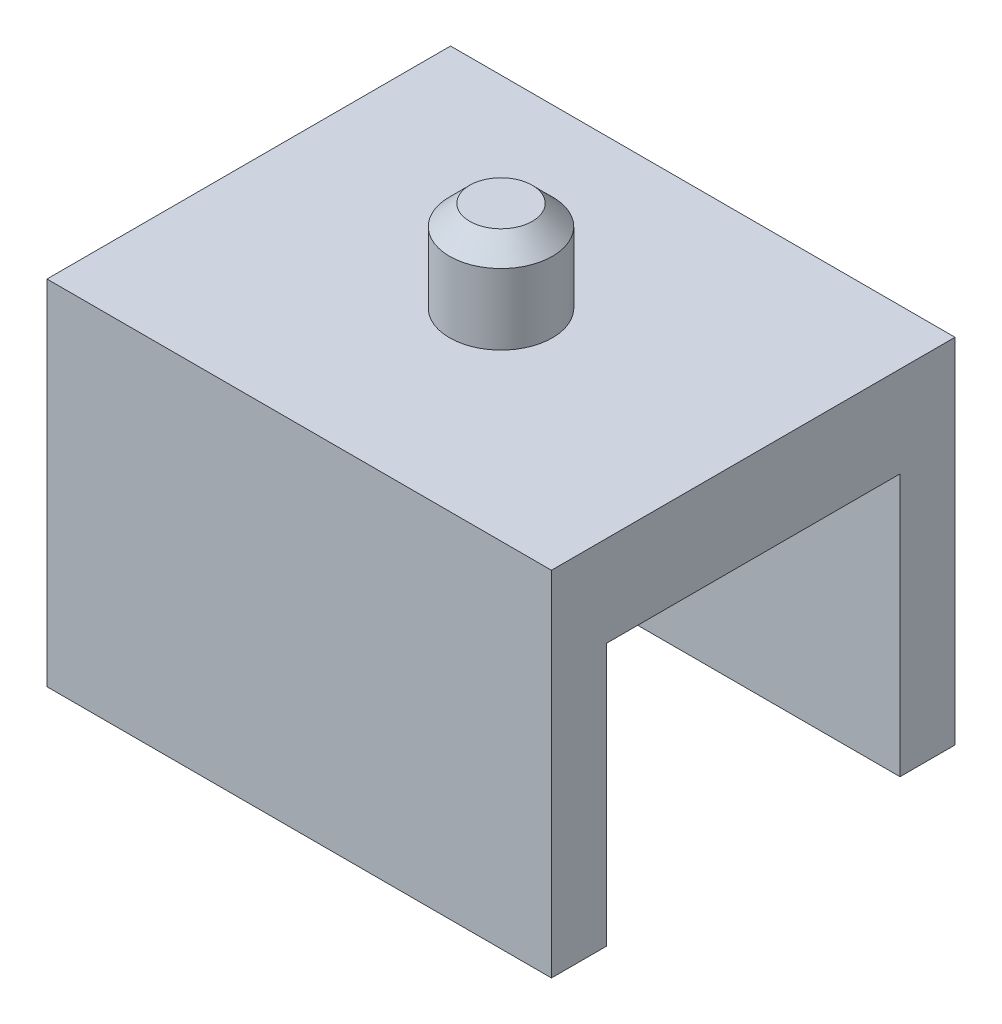
ISO-10303-21;
HEADER;
FILE_DESCRIPTION(('STEP AP214'),'2;1');
FILE_NAME('part.step','',(''),(''),'','','');
FILE_SCHEMA(('AUTOMOTIVE_DESIGN { 1 0 10303 214 1 1 1 1 }'));
ENDSEC;
DATA;
#1=APPLICATION_CONTEXT('core data for automotive mechanical design processes');
#2=APPLICATION_PROTOCOL_DEFINITION('international standard','automotive_design',2000,#1);
#3=PRODUCT_CONTEXT('',#1,'mechanical');
#4=PRODUCT('Part','Part','',(#3));
#5=PRODUCT_RELATED_PRODUCT_CATEGORY('part','',(#4));
#6=PRODUCT_DEFINITION_FORMATION('','',#4);
#7=PRODUCT_DEFINITION_CONTEXT('part definition',#1,'design');
#8=PRODUCT_DEFINITION('design','',#6,#7);
#9=PRODUCT_DEFINITION_SHAPE('','',#8);
#10=(LENGTH_UNIT() NAMED_UNIT(*) SI_UNIT(.MILLI.,.METRE.));
#11=(NAMED_UNIT(*) PLANE_ANGLE_UNIT() SI_UNIT($,.RADIAN.));
#12=(NAMED_UNIT(*) SI_UNIT($,.STERADIAN.) SOLID_ANGLE_UNIT());
#13=UNCERTAINTY_MEASURE_WITH_UNIT(LENGTH_MEASURE(1.E-05),#10,'distance_accuracy_value','');
#14=(GEOMETRIC_REPRESENTATION_CONTEXT(3) GLOBAL_UNCERTAINTY_ASSIGNED_CONTEXT((#13)) GLOBAL_UNIT_ASSIGNED_CONTEXT((#10,
#11,#12)) REPRESENTATION_CONTEXT('',''));
#15=CARTESIAN_POINT('',(0.,0.,0.));
#16=DIRECTION('',(0.,0.,1.));
#17=DIRECTION('',(1.,0.,0.));
#18=AXIS2_PLACEMENT_3D('',#15,#16,#17);
#19=CARTESIAN_POINT('',(12.5,22.,10.));
#20=DIRECTION('',(0.,-1.,0.));
#21=DIRECTION('',(0.,0.,-1.));
#22=AXIS2_PLACEMENT_3D('',#19,#20,#21);
#23=CYLINDRICAL_SURFACE('',#22,2.55);
#24=CARTESIAN_POINT('',(12.5,21.,10.));
#25=DIRECTION('',(0.,1.,0.));
#26=DIRECTION('',(0.,0.,1.));
#27=AXIS2_PLACEMENT_3D('',#24,#25,#26);
#28=CIRCLE('',#27,2.55);
#29=CARTESIAN_POINT('',(12.5,21.,12.55));
#30=VERTEX_POINT('',#29);
#31=EDGE_CURVE('E11',#30,#30,#28,.F.);
#32=ORIENTED_EDGE('',*,*,#31,.T.);
#33=EDGE_LOOP('',(#32));
#34=FACE_BOUND('',#33,.T.);
#35=CARTESIAN_POINT('',(12.5,17.5,10.));
#36=DIRECTION('',(0.,1.,0.));
#37=DIRECTION('',(0.,0.,1.));
#38=AXIS2_PLACEMENT_3D('',#35,#36,#37);
#39=CIRCLE('',#38,2.55);
#40=CARTESIAN_POINT('',(12.5,17.5,12.55));
#41=VERTEX_POINT('',#40);
#42=EDGE_CURVE('E61',#41,#41,#39,.T.);
#43=ORIENTED_EDGE('',*,*,#42,.T.);
#44=EDGE_LOOP('',(#43));
#45=FACE_BOUND('',#44,.T.);
#46=ADVANCED_FACE('F49',(#34,#45),#23,.T.);
#47=CARTESIAN_POINT('',(12.5,22.,10.));
#48=DIRECTION('',(0.,1.,0.));
#49=DIRECTION('',(0.,0.,1.));
#50=AXIS2_PLACEMENT_3D('',#47,#48,#49);
#51=PLANE('',#50);
#52=CARTESIAN_POINT('',(12.5,22.,10.));
#53=DIRECTION('',(0.,1.,0.));
#54=DIRECTION('',(0.,0.,1.));
#55=AXIS2_PLACEMENT_3D('',#52,#53,#54);
#56=CIRCLE('',#55,1.55);
#57=CARTESIAN_POINT('',(12.5,22.,11.55));
#58=VERTEX_POINT('',#57);
#59=EDGE_CURVE('E57',#58,#58,#56,.T.);
#60=ORIENTED_EDGE('',*,*,#59,.T.);
#61=EDGE_LOOP('',(#60));
#62=FACE_BOUND('',#61,.T.);
#63=ADVANCED_FACE('F71',(#62),#51,.T.);
#64=CARTESIAN_POINT('',(12.5,17.5,10.));
#65=DIRECTION('',(0.,1.,0.));
#66=DIRECTION('',(0.,0.,1.));
#67=AXIS2_PLACEMENT_3D('',#64,#65,#66);
#68=PLANE('',#67);
#69=ORIENTED_EDGE('',*,*,#42,.F.);
#70=EDGE_LOOP('',(#69));
#71=FACE_BOUND('',#70,.T.);
#72=ADVANCED_FACE('F69',(#71),#68,.F.);
#73=CARTESIAN_POINT('',(12.5,22.,10.));
#74=DIRECTION('',(0.,-1.,0.));
#75=DIRECTION('',(0.,0.,-1.));
#76=AXIS2_PLACEMENT_3D('',#73,#74,#75);
#77=CONICAL_SURFACE('',#76,1.55,0.785398163397445);
#78=ORIENTED_EDGE('',*,*,#31,.F.);
#79=EDGE_LOOP('',(#78));
#80=FACE_BOUND('',#79,.T.);
#81=ORIENTED_EDGE('',*,*,#59,.F.);
#82=EDGE_LOOP('',(#81));
#83=FACE_BOUND('',#82,.T.);
#84=ADVANCED_FACE('F52',(#80,#83),#77,.T.);
#85=CLOSED_SHELL('',(#46,#63,#72,#84));
#86=MANIFOLD_SOLID_BREP('B2',#85);
#87=CARTESIAN_POINT('',(25.,0.,20.));
#88=DIRECTION('',(0.,1.,0.));
#89=DIRECTION('',(-1.,0.,0.));
#90=AXIS2_PLACEMENT_3D('',#87,#88,#89);
#91=PLANE('',#90);
#92=DIRECTION('',(0.,0.,-1.));
#93=VECTOR('',#92,1.);
#94=CARTESIAN_POINT('',(0.,0.,20.));
#95=LINE('',#94,#93);
#96=CARTESIAN_POINT('',(0.,0.,20.));
#97=VERTEX_POINT('',#96);
#98=CARTESIAN_POINT('',(0.,0.,17.275));
#99=VERTEX_POINT('',#98);
#100=EDGE_CURVE('E237',#97,#99,#95,.T.);
#101=ORIENTED_EDGE('',*,*,#100,.T.);
#102=DIRECTION('',(-1.,0.,0.));
#103=VECTOR('',#102,1.);
#104=CARTESIAN_POINT('',(25.,0.,17.275));
#105=LINE('',#104,#103);
#106=CARTESIAN_POINT('',(25.,0.,17.275));
#107=VERTEX_POINT('',#106);
#108=EDGE_CURVE('E202',#107,#99,#105,.T.);
#109=ORIENTED_EDGE('',*,*,#108,.F.);
#110=DIRECTION('',(0.,0.,-1.));
#111=VECTOR('',#110,1.);
#112=CARTESIAN_POINT('',(25.,0.,20.));
#113=LINE('',#112,#111);
#114=CARTESIAN_POINT('',(25.,0.,20.));
#115=VERTEX_POINT('',#114);
#116=EDGE_CURVE('E250',#115,#107,#113,.T.);
#117=ORIENTED_EDGE('',*,*,#116,.F.);
#118=DIRECTION('',(1.,0.,0.));
#119=VECTOR('',#118,1.);
#120=CARTESIAN_POINT('',(25.,0.,20.));
#121=LINE('',#120,#119);
#122=EDGE_CURVE('E214',#97,#115,#121,.T.);
#123=ORIENTED_EDGE('',*,*,#122,.F.);
#124=EDGE_LOOP('',(#101,#109,#117,#123));
#125=FACE_BOUND('',#124,.T.);
#126=ADVANCED_FACE('F108',(#125),#91,.F.);
#127=CARTESIAN_POINT('',(25.,0.,2.725));
#128=VERTEX_POINT('',#127);
#129=CARTESIAN_POINT('',(25.,0.,0.));
#130=VERTEX_POINT('',#129);
#131=EDGE_CURVE('E249',#128,#130,#113,.T.);
#132=ORIENTED_EDGE('',*,*,#131,.F.);
#133=DIRECTION('',(1.,0.,0.));
#134=VECTOR('',#133,1.);
#135=CARTESIAN_POINT('',(0.,0.,2.725));
#136=LINE('',#135,#134);
#137=CARTESIAN_POINT('',(0.,0.,2.725));
#138=VERTEX_POINT('',#137);
#139=EDGE_CURVE('E307',#138,#128,#136,.T.);
#140=ORIENTED_EDGE('',*,*,#139,.F.);
#141=CARTESIAN_POINT('',(0.,0.,0.));
#142=VERTEX_POINT('',#141);
#143=EDGE_CURVE('E156',#138,#142,#95,.T.);
#144=ORIENTED_EDGE('',*,*,#143,.T.);
#145=DIRECTION('',(1.,0.,0.));
#146=VECTOR('',#145,1.);
#147=CARTESIAN_POINT('',(25.,0.,0.));
#148=LINE('',#147,#146);
#149=EDGE_CURVE('E225',#142,#130,#148,.T.);
#150=ORIENTED_EDGE('',*,*,#149,.T.);
#151=EDGE_LOOP('',(#132,#140,#144,#150));
#152=FACE_BOUND('',#151,.T.);
#153=ADVANCED_FACE('F267',(#152),#91,.F.);
#154=CARTESIAN_POINT('',(25.,17.5,20.));
#155=DIRECTION('',(-1.,0.,0.));
#156=DIRECTION('',(0.,-1.,0.));
#157=AXIS2_PLACEMENT_3D('',#154,#155,#156);
#158=PLANE('',#157);
#159=ORIENTED_EDGE('',*,*,#116,.T.);
#160=DIRECTION('',(0.,-1.,0.));
#161=VECTOR('',#160,1.);
#162=CARTESIAN_POINT('',(25.,13.,17.275));
#163=LINE('',#162,#161);
#164=CARTESIAN_POINT('',(25.,13.,17.275));
#165=VERTEX_POINT('',#164);
#166=EDGE_CURVE('E209',#165,#107,#163,.T.);
#167=ORIENTED_EDGE('',*,*,#166,.F.);
#168=DIRECTION('',(0.,0.,1.));
#169=VECTOR('',#168,1.);
#170=CARTESIAN_POINT('',(25.,13.,2.725));
#171=LINE('',#170,#169);
#172=CARTESIAN_POINT('',(25.,13.,2.725));
#173=VERTEX_POINT('',#172);
#174=EDGE_CURVE('E194',#173,#165,#171,.T.);
#175=ORIENTED_EDGE('',*,*,#174,.F.);
#176=DIRECTION('',(0.,-1.,0.));
#177=VECTOR('',#176,1.);
#178=CARTESIAN_POINT('',(25.,13.,2.725));
#179=LINE('',#178,#177);
#180=EDGE_CURVE('E191',#173,#128,#179,.T.);
#181=ORIENTED_EDGE('',*,*,#180,.T.);
#182=ORIENTED_EDGE('',*,*,#131,.T.);
#183=DIRECTION('',(0.,1.,0.));
#184=VECTOR('',#183,1.);
#185=CARTESIAN_POINT('',(25.,17.5,0.));
#186=LINE('',#185,#184);
#187=CARTESIAN_POINT('',(25.,17.5,0.));
#188=VERTEX_POINT('',#187);
#189=EDGE_CURVE('E228',#130,#188,#186,.T.);
#190=ORIENTED_EDGE('',*,*,#189,.T.);
#191=DIRECTION('',(0.,0.,-1.));
#192=VECTOR('',#191,1.);
#193=CARTESIAN_POINT('',(25.,17.5,20.));
#194=LINE('',#193,#192);
#195=CARTESIAN_POINT('',(25.,17.5,20.));
#196=VERTEX_POINT('',#195);
#197=EDGE_CURVE('E245',#196,#188,#194,.T.);
#198=ORIENTED_EDGE('',*,*,#197,.F.);
#199=DIRECTION('',(0.,1.,0.));
#200=VECTOR('',#199,1.);
#201=CARTESIAN_POINT('',(25.,17.5,20.));
#202=LINE('',#201,#200);
#203=EDGE_CURVE('E164',#115,#196,#202,.T.);
#204=ORIENTED_EDGE('',*,*,#203,.F.);
#205=EDGE_LOOP('',(#159,#167,#175,#181,#182,#190,#198,#204));
#206=FACE_BOUND('',#205,.T.);
#207=ADVANCED_FACE('F272',(#206),#158,.F.);
#208=CARTESIAN_POINT('',(0.,17.5,20.));
#209=DIRECTION('',(0.,-1.,0.));
#210=DIRECTION('',(0.,0.,-1.));
#211=AXIS2_PLACEMENT_3D('',#208,#209,#210);
#212=PLANE('',#211);
#213=DIRECTION('',(-1.,0.,0.));
#214=VECTOR('',#213,1.);
#215=CARTESIAN_POINT('',(0.,17.5,0.));
#216=LINE('',#215,#214);
#217=CARTESIAN_POINT('',(0.,17.5,0.));
#218=VERTEX_POINT('',#217);
#219=EDGE_CURVE('E232',#188,#218,#216,.T.);
#220=ORIENTED_EDGE('',*,*,#219,.T.);
#221=DIRECTION('',(0.,0.,-1.));
#222=VECTOR('',#221,1.);
#223=CARTESIAN_POINT('',(0.,17.5,20.));
#224=LINE('',#223,#222);
#225=CARTESIAN_POINT('',(0.,17.5,20.));
#226=VERTEX_POINT('',#225);
#227=EDGE_CURVE('E241',#226,#218,#224,.T.);
#228=ORIENTED_EDGE('',*,*,#227,.F.);
#229=DIRECTION('',(-1.,0.,0.));
#230=VECTOR('',#229,1.);
#231=CARTESIAN_POINT('',(0.,17.5,20.));
#232=LINE('',#231,#230);
#233=EDGE_CURVE('E220',#196,#226,#232,.T.);
#234=ORIENTED_EDGE('',*,*,#233,.F.);
#235=ORIENTED_EDGE('',*,*,#197,.T.);
#236=EDGE_LOOP('',(#220,#228,#234,#235));
#237=FACE_BOUND('',#236,.T.);
#238=ADVANCED_FACE('F276',(#237),#212,.F.);
#239=CARTESIAN_POINT('',(0.,0.,20.));
#240=DIRECTION('',(1.,0.,0.));
#241=DIRECTION('',(0.,0.,-1.));
#242=AXIS2_PLACEMENT_3D('',#239,#240,#241);
#243=PLANE('',#242);
#244=DIRECTION('',(0.,0.,-1.));
#245=VECTOR('',#244,1.);
#246=CARTESIAN_POINT('',(0.,13.,17.275));
#247=LINE('',#246,#245);
#248=CARTESIAN_POINT('',(0.,13.,17.275));
#249=VERTEX_POINT('',#248);
#250=CARTESIAN_POINT('',(0.,13.,2.725));
#251=VERTEX_POINT('',#250);
#252=EDGE_CURVE('E195',#249,#251,#247,.T.);
#253=ORIENTED_EDGE('',*,*,#252,.F.);
#254=DIRECTION('',(0.,-1.,0.));
#255=VECTOR('',#254,1.);
#256=CARTESIAN_POINT('',(0.,13.,17.275));
#257=LINE('',#256,#255);
#258=EDGE_CURVE('E229',#249,#99,#257,.T.);
#259=ORIENTED_EDGE('',*,*,#258,.T.);
#260=ORIENTED_EDGE('',*,*,#100,.F.);
#261=DIRECTION('',(0.,-1.,0.));
#262=VECTOR('',#261,1.);
#263=CARTESIAN_POINT('',(0.,0.,20.));
#264=LINE('',#263,#262);
#265=EDGE_CURVE('E134',#226,#97,#264,.T.);
#266=ORIENTED_EDGE('',*,*,#265,.F.);
#267=ORIENTED_EDGE('',*,*,#227,.T.);
#268=DIRECTION('',(0.,-1.,0.));
#269=VECTOR('',#268,1.);
#270=CARTESIAN_POINT('',(0.,0.,0.));
#271=LINE('',#270,#269);
#272=EDGE_CURVE('E217',#218,#142,#271,.T.);
#273=ORIENTED_EDGE('',*,*,#272,.T.);
#274=ORIENTED_EDGE('',*,*,#143,.F.);
#275=DIRECTION('',(0.,-1.,0.));
#276=VECTOR('',#275,1.);
#277=CARTESIAN_POINT('',(0.,13.,2.725));
#278=LINE('',#277,#276);
#279=EDGE_CURVE('E189',#251,#138,#278,.T.);
#280=ORIENTED_EDGE('',*,*,#279,.F.);
#281=EDGE_LOOP('',(#253,#259,#260,#266,#267,#273,#274,#280));
#282=FACE_BOUND('',#281,.T.);
#283=ADVANCED_FACE('F204',(#282),#243,.F.);
#284=CARTESIAN_POINT('',(0.,0.,20.));
#285=DIRECTION('',(0.,0.,-1.));
#286=DIRECTION('',(-1.,0.,0.));
#287=AXIS2_PLACEMENT_3D('',#284,#285,#286);
#288=PLANE('',#287);
#289=ORIENTED_EDGE('',*,*,#122,.T.);
#290=ORIENTED_EDGE('',*,*,#203,.T.);
#291=ORIENTED_EDGE('',*,*,#233,.T.);
#292=ORIENTED_EDGE('',*,*,#265,.T.);
#293=EDGE_LOOP('',(#289,#290,#291,#292));
#294=FACE_BOUND('',#293,.T.);
#295=ADVANCED_FACE('F282',(#294),#288,.F.);
#296=CARTESIAN_POINT('',(0.,0.,0.));
#297=DIRECTION('',(0.,0.,-1.));
#298=DIRECTION('',(-1.,0.,0.));
#299=AXIS2_PLACEMENT_3D('',#296,#297,#298);
#300=PLANE('',#299);
#301=ORIENTED_EDGE('',*,*,#149,.F.);
#302=ORIENTED_EDGE('',*,*,#272,.F.);
#303=ORIENTED_EDGE('',*,*,#219,.F.);
#304=ORIENTED_EDGE('',*,*,#189,.F.);
#305=EDGE_LOOP('',(#301,#302,#303,#304));
#306=FACE_BOUND('',#305,.T.);
#307=ADVANCED_FACE('F283',(#306),#300,.T.);
#308=CARTESIAN_POINT('',(25.,13.,17.275));
#309=DIRECTION('',(0.,0.,1.));
#310=DIRECTION('',(1.,0.,0.));
#311=AXIS2_PLACEMENT_3D('',#308,#309,#310);
#312=PLANE('',#311);
#313=ORIENTED_EDGE('',*,*,#108,.T.);
#314=ORIENTED_EDGE('',*,*,#258,.F.);
#315=DIRECTION('',(-1.,0.,0.));
#316=VECTOR('',#315,1.);
#317=CARTESIAN_POINT('',(25.,13.,17.275));
#318=LINE('',#317,#316);
#319=EDGE_CURVE('E125',#165,#249,#318,.T.);
#320=ORIENTED_EDGE('',*,*,#319,.F.);
#321=ORIENTED_EDGE('',*,*,#166,.T.);
#322=EDGE_LOOP('',(#313,#314,#320,#321));
#323=FACE_BOUND('',#322,.T.);
#324=ADVANCED_FACE('F286',(#323),#312,.F.);
#325=CARTESIAN_POINT('',(0.,13.,2.725));
#326=DIRECTION('',(0.,0.,-1.));
#327=DIRECTION('',(-1.,0.,0.));
#328=AXIS2_PLACEMENT_3D('',#325,#326,#327);
#329=PLANE('',#328);
#330=ORIENTED_EDGE('',*,*,#139,.T.);
#331=ORIENTED_EDGE('',*,*,#180,.F.);
#332=DIRECTION('',(1.,0.,0.));
#333=VECTOR('',#332,1.);
#334=CARTESIAN_POINT('',(0.,13.,2.725));
#335=LINE('',#334,#333);
#336=EDGE_CURVE('E186',#251,#173,#335,.T.);
#337=ORIENTED_EDGE('',*,*,#336,.F.);
#338=ORIENTED_EDGE('',*,*,#279,.T.);
#339=EDGE_LOOP('',(#330,#331,#337,#338));
#340=FACE_BOUND('',#339,.T.);
#341=ADVANCED_FACE('F187',(#340),#329,.F.);
#342=CARTESIAN_POINT('',(0.,13.,0.));
#343=DIRECTION('',(0.,-1.,0.));
#344=DIRECTION('',(1.,0.,0.));
#345=AXIS2_PLACEMENT_3D('',#342,#343,#344);
#346=PLANE('',#345);
#347=CARTESIAN_POINT('',(12.5,13.,10.));
#348=DIRECTION('',(0.,-1.,0.));
#349=DIRECTION('',(1.,0.,0.));
#350=AXIS2_PLACEMENT_3D('',#347,#348,#349);
#351=CIRCLE('',#350,1.25);
#352=CARTESIAN_POINT('',(13.75,13.,10.));
#353=VERTEX_POINT('',#352);
#354=EDGE_CURVE('E305',#353,#353,#351,.T.);
#355=ORIENTED_EDGE('',*,*,#354,.F.);
#356=EDGE_LOOP('',(#355));
#357=FACE_BOUND('',#356,.T.);
#358=ORIENTED_EDGE('',*,*,#252,.T.);
#359=ORIENTED_EDGE('',*,*,#336,.T.);
#360=ORIENTED_EDGE('',*,*,#174,.T.);
#361=ORIENTED_EDGE('',*,*,#319,.T.);
#362=EDGE_LOOP('',(#358,#359,#360,#361));
#363=FACE_BOUND('',#362,.T.);
#364=ADVANCED_FACE('F198',(#357,#363),#346,.T.);
#365=CARTESIAN_POINT('',(12.5,10.,10.));
#366=DIRECTION('',(0.,1.,0.));
#367=DIRECTION('',(-1.,0.,0.));
#368=AXIS2_PLACEMENT_3D('',#365,#366,#367);
#369=CYLINDRICAL_SURFACE('',#368,1.25);
#370=CARTESIAN_POINT('',(12.5,11.,10.));
#371=DIRECTION('',(0.,-1.,0.));
#372=DIRECTION('',(0.,0.,-1.));
#373=AXIS2_PLACEMENT_3D('',#370,#371,#372);
#374=CIRCLE('',#373,1.25);
#375=CARTESIAN_POINT('',(12.5,11.,11.25));
#376=VERTEX_POINT('',#375);
#377=EDGE_CURVE('E47',#376,#376,#374,.F.);
#378=ORIENTED_EDGE('',*,*,#377,.T.);
#379=EDGE_LOOP('',(#378));
#380=FACE_BOUND('',#379,.T.);
#381=ORIENTED_EDGE('',*,*,#354,.T.);
#382=EDGE_LOOP('',(#381));
#383=FACE_BOUND('',#382,.T.);
#384=ADVANCED_FACE('F263',(#380,#383),#369,.T.);
#385=CARTESIAN_POINT('',(12.5,10.,10.));
#386=DIRECTION('',(0.,-1.,0.));
#387=DIRECTION('',(1.,0.,0.));
#388=AXIS2_PLACEMENT_3D('',#385,#386,#387);
#389=PLANE('',#388);
#390=CARTESIAN_POINT('',(12.5,10.,10.));
#391=DIRECTION('',(0.,-1.,0.));
#392=DIRECTION('',(1.,0.,0.));
#393=AXIS2_PLACEMENT_3D('',#390,#391,#392);
#394=CIRCLE('',#393,0.250000000000004);
#395=CARTESIAN_POINT('',(12.5,10.,10.25));
#396=VERTEX_POINT('',#395);
#397=EDGE_CURVE('E118',#396,#396,#394,.T.);
#398=ORIENTED_EDGE('',*,*,#397,.T.);
#399=EDGE_LOOP('',(#398));
#400=FACE_BOUND('',#399,.T.);
#401=ADVANCED_FACE('F256',(#400),#389,.T.);
#402=CARTESIAN_POINT('',(12.5,10.,10.));
#403=DIRECTION('',(0.,1.,0.));
#404=DIRECTION('',(0.,0.,1.));
#405=AXIS2_PLACEMENT_3D('',#402,#403,#404);
#406=CONICAL_SURFACE('',#405,0.250000000000004,0.785398163397446);
#407=CARTESIAN_POINT('',(12.5,11.,11.25));
#408=CARTESIAN_POINT('',(12.5,10.9895833333333,11.2395833333333));
#409=CARTESIAN_POINT('',(12.5,10.9791666666667,11.2291666666667));
#410=CARTESIAN_POINT('',(12.5,10.9583333333333,11.2083333333333));
#411=CARTESIAN_POINT('',(12.5,10.9479166666667,11.1979166666667));
#412=CARTESIAN_POINT('',(12.5,10.9270833333333,11.1770833333333));
#413=CARTESIAN_POINT('',(12.5,10.9166666666667,11.1666666666667));
#414=CARTESIAN_POINT('',(12.5,10.8958333333333,11.1458333333333));
#415=CARTESIAN_POINT('',(12.5,10.8854166666667,11.1354166666667));
#416=CARTESIAN_POINT('',(12.5,10.8645833333333,11.1145833333333));
#417=CARTESIAN_POINT('',(12.5,10.8541666666667,11.1041666666667));
#418=CARTESIAN_POINT('',(12.5,10.8333333333333,11.0833333333333));
#419=CARTESIAN_POINT('',(12.5,10.8229166666667,11.0729166666667));
#420=CARTESIAN_POINT('',(12.5,10.8020833333333,11.0520833333333));
#421=CARTESIAN_POINT('',(12.5,10.7916666666667,11.0416666666667));
#422=CARTESIAN_POINT('',(12.5,10.7708333333333,11.0208333333333));
#423=CARTESIAN_POINT('',(12.5,10.7604166666667,11.0104166666667));
#424=CARTESIAN_POINT('',(12.5,10.7395833333333,10.9895833333333));
#425=CARTESIAN_POINT('',(12.5,10.7291666666667,10.9791666666667));
#426=CARTESIAN_POINT('',(12.5,10.7083333333333,10.9583333333333));
#427=CARTESIAN_POINT('',(12.5,10.6979166666667,10.9479166666667));
#428=CARTESIAN_POINT('',(12.5,10.6770833333333,10.9270833333333));
#429=CARTESIAN_POINT('',(12.5,10.6666666666667,10.9166666666667));
#430=CARTESIAN_POINT('',(12.5,10.6458333333333,10.8958333333333));
#431=CARTESIAN_POINT('',(12.5,10.6354166666667,10.8854166666667));
#432=CARTESIAN_POINT('',(12.5,10.6145833333333,10.8645833333333));
#433=CARTESIAN_POINT('',(12.5,10.6041666666667,10.8541666666667));
#434=CARTESIAN_POINT('',(12.5,10.5833333333333,10.8333333333333));
#435=CARTESIAN_POINT('',(12.5,10.5729166666667,10.8229166666667));
#436=CARTESIAN_POINT('',(12.5,10.5520833333333,10.8020833333333));
#437=CARTESIAN_POINT('',(12.5,10.5416666666667,10.7916666666667));
#438=CARTESIAN_POINT('',(12.5,10.5208333333333,10.7708333333333));
#439=CARTESIAN_POINT('',(12.5,10.5104166666667,10.7604166666667));
#440=CARTESIAN_POINT('',(12.5,10.4895833333333,10.7395833333333));
#441=CARTESIAN_POINT('',(12.5,10.4791666666667,10.7291666666667));
#442=CARTESIAN_POINT('',(12.5,10.4583333333333,10.7083333333333));
#443=CARTESIAN_POINT('',(12.5,10.4479166666667,10.6979166666667));
#444=CARTESIAN_POINT('',(12.5,10.4270833333333,10.6770833333333));
#445=CARTESIAN_POINT('',(12.5,10.4166666666667,10.6666666666667));
#446=CARTESIAN_POINT('',(12.5,10.3958333333333,10.6458333333333));
#447=CARTESIAN_POINT('',(12.5,10.3854166666667,10.6354166666667));
#448=CARTESIAN_POINT('',(12.5,10.3645833333333,10.6145833333333));
#449=CARTESIAN_POINT('',(12.5,10.3541666666667,10.6041666666667));
#450=CARTESIAN_POINT('',(12.5,10.3333333333333,10.5833333333333));
#451=CARTESIAN_POINT('',(12.5,10.3229166666667,10.5729166666667));
#452=CARTESIAN_POINT('',(12.5,10.3020833333333,10.5520833333333));
#453=CARTESIAN_POINT('',(12.5,10.2916666666667,10.5416666666667));
#454=CARTESIAN_POINT('',(12.5,10.2708333333333,10.5208333333333));
#455=CARTESIAN_POINT('',(12.5,10.2604166666667,10.5104166666667));
#456=CARTESIAN_POINT('',(12.5,10.2395833333333,10.4895833333333));
#457=CARTESIAN_POINT('',(12.5,10.2291666666667,10.4791666666667));
#458=CARTESIAN_POINT('',(12.5,10.2083333333333,10.4583333333333));
#459=CARTESIAN_POINT('',(12.5,10.1979166666667,10.4479166666667));
#460=CARTESIAN_POINT('',(12.5,10.1770833333333,10.4270833333333));
#461=CARTESIAN_POINT('',(12.5,10.1666666666667,10.4166666666667));
#462=CARTESIAN_POINT('',(12.5,10.1458333333333,10.3958333333333));
#463=CARTESIAN_POINT('',(12.5,10.1354166666667,10.3854166666667));
#464=CARTESIAN_POINT('',(12.5,10.1145833333333,10.3645833333333));
#465=CARTESIAN_POINT('',(12.5,10.1041666666667,10.3541666666667));
#466=CARTESIAN_POINT('',(12.5,10.0833333333333,10.3333333333333));
#467=CARTESIAN_POINT('',(12.5,10.0729166666667,10.3229166666667));
#468=CARTESIAN_POINT('',(12.5,10.0520833333333,10.3020833333333));
#469=CARTESIAN_POINT('',(12.5,10.0416666666667,10.2916666666667));
#470=CARTESIAN_POINT('',(12.5,10.0208333333333,10.2708333333333));
#471=CARTESIAN_POINT('',(12.5,10.0104166666667,10.2604166666667));
#472=CARTESIAN_POINT('',(12.5,10.,10.25));
#473=B_SPLINE_CURVE_WITH_KNOTS('',3,(#407,#408,#409,#410,#411,#412,#413,#414,#415,#416,#417,
#418,#419,#420,#421,#422,#423,#424,#425,#426,#427,#428,#429,#430,#431,#432,#433,#434,#435,#436,
#437,#438,#439,#440,#441,#442,#443,#444,#445,#446,#447,#448,#449,#450,#451,#452,#453,#454,#455,
#456,#457,#458,#459,#460,#461,#462,#463,#464,#465,#466,#467,#468,#469,#470,#471,#472),
.UNSPECIFIED.,.F.,.F.,(4,2,2,2,2,2,2,2,2,2,2,2,2,2,2,2,2,2,2,2,2,2,2,2,2,2,2,2,2,2,2,2,4),(0.,
0.0441941738241593,0.0883883476483185,0.132582521472477,0.176776695296636,0.220970869120795,
0.265165042944954,0.309359216769114,0.353553390593273,0.397747564417432,0.441941738241591,
0.486135912065751,0.530330085889909,0.574524259714068,0.618718433538227,0.662912607362387,
0.707106781186546,0.751300955010705,0.795495128834864,0.839689302659024,0.883883476483183,
0.928077650307342,0.972271824131502,1.01646599795566,1.06066017177982,1.10485434560398,
1.14904851942814,1.1932426932523,1.23743686707646,1.28163104090062,1.32582521472477,
1.37001938854893,1.41421356237309),.UNSPECIFIED.);
#474=EDGE_CURVE('BSEAM111',#376,#396,#473,.T.);
#475=ORIENTED_EDGE('',*,*,#377,.F.);
#476=ORIENTED_EDGE('',*,*,#397,.F.);
#477=ORIENTED_EDGE('',*,*,#474,.T.);
#478=ORIENTED_EDGE('',*,*,#474,.F.);
#479=EDGE_LOOP('',(#475,#477,#476,#478));
#480=FACE_BOUND('',#479,.T.);
#481=ADVANCED_FACE('F111',(#480),#406,.T.);
#482=CLOSED_SHELL('',(#126,#153,#207,#238,#283,#295,#307,#324,#341,#364,#384,#401,#481));
#483=MANIFOLD_SOLID_BREP('B6',#482);
#484=ADVANCED_BREP_SHAPE_REPRESENTATION('',(#18,#86,#483),#14);
#485=SHAPE_DEFINITION_REPRESENTATION(#9,#484);
ENDSEC;
END-ISO-10303-21;
